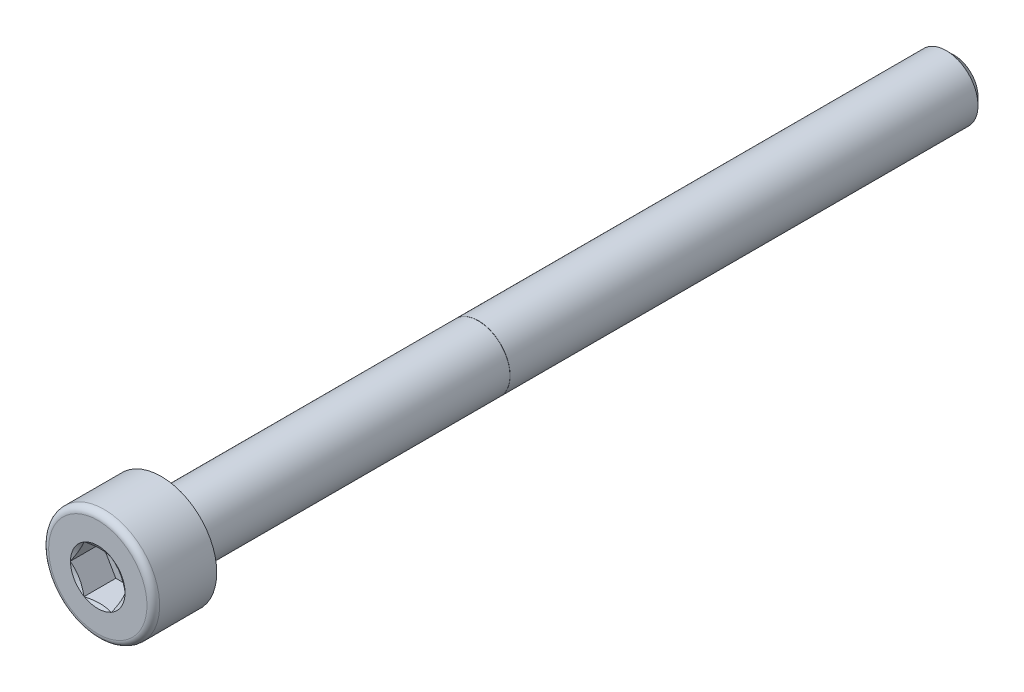
ISO-10303-21;
HEADER;
FILE_DESCRIPTION(('STEP AP214'),'2;1');
FILE_NAME('part.step','',(''),(''),'','','');
FILE_SCHEMA(('AUTOMOTIVE_DESIGN { 1 0 10303 214 1 1 1 1 }'));
ENDSEC;
DATA;
#1=APPLICATION_CONTEXT('core data for automotive mechanical design processes');
#2=APPLICATION_PROTOCOL_DEFINITION('international standard','automotive_design',2000,#1);
#3=PRODUCT_CONTEXT('',#1,'mechanical');
#4=PRODUCT('Part','Part','',(#3));
#5=PRODUCT_RELATED_PRODUCT_CATEGORY('part','',(#4));
#6=PRODUCT_DEFINITION_FORMATION('','',#4);
#7=PRODUCT_DEFINITION_CONTEXT('part definition',#1,'design');
#8=PRODUCT_DEFINITION('design','',#6,#7);
#9=PRODUCT_DEFINITION_SHAPE('','',#8);
#10=(LENGTH_UNIT() NAMED_UNIT(*) SI_UNIT(.MILLI.,.METRE.));
#11=(NAMED_UNIT(*) PLANE_ANGLE_UNIT() SI_UNIT($,.RADIAN.));
#12=(NAMED_UNIT(*) SI_UNIT($,.STERADIAN.) SOLID_ANGLE_UNIT());
#13=UNCERTAINTY_MEASURE_WITH_UNIT(LENGTH_MEASURE(1.E-05),#10,'distance_accuracy_value','');
#14=(GEOMETRIC_REPRESENTATION_CONTEXT(3) GLOBAL_UNCERTAINTY_ASSIGNED_CONTEXT((#13)) GLOBAL_UNIT_ASSIGNED_CONTEXT((#10,
#11,#12)) REPRESENTATION_CONTEXT('',''));
#15=CARTESIAN_POINT('',(0.,0.,0.));
#16=DIRECTION('',(0.,0.,1.));
#17=DIRECTION('',(1.,0.,0.));
#18=AXIS2_PLACEMENT_3D('',#15,#16,#17);
#19=CARTESIAN_POINT('',(0.,0.,4.));
#20=DIRECTION('',(0.,0.,-1.));
#21=DIRECTION('',(-1.,0.,0.));
#22=AXIS2_PLACEMENT_3D('',#19,#20,#21);
#23=PLANE('',#22);
#24=CARTESIAN_POINT('',(0.,0.,4.));
#25=DIRECTION('',(0.,0.,-1.));
#26=DIRECTION('',(-1.,0.,0.));
#27=AXIS2_PLACEMENT_3D('',#24,#25,#26);
#28=CIRCLE('',#27,3.1);
#29=CARTESIAN_POINT('',(-3.1,0.,4.));
#30=VERTEX_POINT('',#29);
#31=EDGE_CURVE('E210',#30,#30,#28,.F.);
#32=ORIENTED_EDGE('',*,*,#31,.T.);
#33=EDGE_LOOP('',(#32));
#34=FACE_BOUND('',#33,.T.);
#35=CARTESIAN_POINT('',(0.,0.,4.));
#36=DIRECTION('',(0.,0.,-1.));
#37=DIRECTION('',(-1.,0.,0.));
#38=AXIS2_PLACEMENT_3D('',#35,#36,#37);
#39=CIRCLE('',#38,1.72);
#40=CARTESIAN_POINT('',(-0.878205597426642,-1.47890328576567,4.));
#41=VERTEX_POINT('',#40);
#42=CARTESIAN_POINT('',(-1.71987061392668,-0.0210967142343167,4.));
#43=VERTEX_POINT('',#42);
#44=EDGE_CURVE('E421',#41,#43,#39,.T.);
#45=ORIENTED_EDGE('',*,*,#44,.T.);
#46=DIRECTION('',(-0.5,0.866025403784439,0.));
#47=VECTOR('',#46,1.);
#48=CARTESIAN_POINT('',(-0.866025403784435,-1.5,4.));
#49=LINE('',#48,#47);
#50=CARTESIAN_POINT('',(-1.73205080756887,0.,4.));
#51=VERTEX_POINT('',#50);
#52=EDGE_CURVE('E185',#43,#51,#49,.T.);
#53=ORIENTED_EDGE('',*,*,#52,.T.);
#54=DIRECTION('',(0.5,0.866025403784439,0.));
#55=VECTOR('',#54,1.);
#56=CARTESIAN_POINT('',(-1.73205080756887,0.,4.));
#57=LINE('',#56,#55);
#58=CARTESIAN_POINT('',(-1.71987061392667,0.0210967142343279,4.));
#59=VERTEX_POINT('',#58);
#60=EDGE_CURVE('E371',#51,#59,#57,.T.);
#61=ORIENTED_EDGE('',*,*,#60,.T.);
#62=CARTESIAN_POINT('',(-0.878205597426635,1.47890328576568,4.));
#63=VERTEX_POINT('',#62);
#64=EDGE_CURVE('E429',#59,#63,#39,.T.);
#65=ORIENTED_EDGE('',*,*,#64,.T.);
#66=CARTESIAN_POINT('',(-0.866025403784434,1.5,4.));
#67=VERTEX_POINT('',#66);
#68=EDGE_CURVE('E184',#63,#67,#57,.T.);
#69=ORIENTED_EDGE('',*,*,#68,.T.);
#70=DIRECTION('',(1.,0.,0.));
#71=VECTOR('',#70,1.);
#72=CARTESIAN_POINT('',(-0.866025403784435,1.5,4.));
#73=LINE('',#72,#71);
#74=CARTESIAN_POINT('',(-0.84166501650002,1.5,4.));
#75=VERTEX_POINT('',#74);
#76=EDGE_CURVE('E374',#67,#75,#73,.T.);
#77=ORIENTED_EDGE('',*,*,#76,.T.);
#78=CARTESIAN_POINT('',(0.841665016500033,1.5,4.));
#79=VERTEX_POINT('',#78);
#80=EDGE_CURVE('E389',#75,#79,#39,.T.);
#81=ORIENTED_EDGE('',*,*,#80,.T.);
#82=CARTESIAN_POINT('',(0.866025403784442,1.5,4.));
#83=VERTEX_POINT('',#82);
#84=EDGE_CURVE('E373',#79,#83,#73,.T.);
#85=ORIENTED_EDGE('',*,*,#84,.T.);
#86=DIRECTION('',(0.5,-0.866025403784439,0.));
#87=VECTOR('',#86,1.);
#88=CARTESIAN_POINT('',(0.866025403784443,1.5,4.));
#89=LINE('',#88,#87);
#90=CARTESIAN_POINT('',(0.878205597426654,1.47890328576566,4.));
#91=VERTEX_POINT('',#90);
#92=EDGE_CURVE('E174',#83,#91,#89,.T.);
#93=ORIENTED_EDGE('',*,*,#92,.T.);
#94=CARTESIAN_POINT('',(1.71987061392668,0.0210967142343314,4.));
#95=VERTEX_POINT('',#94);
#96=EDGE_CURVE('E149',#91,#95,#39,.T.);
#97=ORIENTED_EDGE('',*,*,#96,.T.);
#98=CARTESIAN_POINT('',(1.73205080756888,0.,4.));
#99=VERTEX_POINT('',#98);
#100=EDGE_CURVE('E161',#95,#99,#89,.T.);
#101=ORIENTED_EDGE('',*,*,#100,.T.);
#102=DIRECTION('',(-0.5,-0.866025403784439,0.));
#103=VECTOR('',#102,1.);
#104=CARTESIAN_POINT('',(1.73205080756888,0.,4.));
#105=LINE('',#104,#103);
#106=CARTESIAN_POINT('',(1.71987061392667,-0.0210967142343424,4.));
#107=VERTEX_POINT('',#106);
#108=EDGE_CURVE('E154',#99,#107,#105,.T.);
#109=ORIENTED_EDGE('',*,*,#108,.T.);
#110=CARTESIAN_POINT('',(0.878205597426648,-1.47890328576567,4.));
#111=VERTEX_POINT('',#110);
#112=EDGE_CURVE('E140',#107,#111,#39,.T.);
#113=ORIENTED_EDGE('',*,*,#112,.T.);
#114=CARTESIAN_POINT('',(0.866025403784443,-1.5,4.));
#115=VERTEX_POINT('',#114);
#116=EDGE_CURVE('E156',#111,#115,#105,.T.);
#117=ORIENTED_EDGE('',*,*,#116,.T.);
#118=DIRECTION('',(-1.,0.,0.));
#119=VECTOR('',#118,1.);
#120=CARTESIAN_POINT('',(0.866025403784443,-1.5,4.));
#121=LINE('',#120,#119);
#122=CARTESIAN_POINT('',(0.84166501650002,-1.5,4.));
#123=VERTEX_POINT('',#122);
#124=EDGE_CURVE('E171',#115,#123,#121,.T.);
#125=ORIENTED_EDGE('',*,*,#124,.T.);
#126=CARTESIAN_POINT('',(-0.841665016500033,-1.5,4.));
#127=VERTEX_POINT('',#126);
#128=EDGE_CURVE('E147',#123,#127,#39,.T.);
#129=ORIENTED_EDGE('',*,*,#128,.T.);
#130=CARTESIAN_POINT('',(-0.866025403784435,-1.5,4.));
#131=VERTEX_POINT('',#130);
#132=EDGE_CURVE('E164',#127,#131,#121,.T.);
#133=ORIENTED_EDGE('',*,*,#132,.T.);
#134=EDGE_CURVE('E180',#131,#41,#49,.T.);
#135=ORIENTED_EDGE('',*,*,#134,.T.);
#136=EDGE_LOOP('',(#45,#53,#61,#65,#69,#77,#81,#85,#93,#97,#101,#109,#113,#117,#125,#129,#133,#135));
#137=FACE_BOUND('',#136,.T.);
#138=ADVANCED_FACE('F52',(#34,#137),#23,.F.);
#139=CARTESIAN_POINT('',(-0.866025403784435,-1.5,2.));
#140=DIRECTION('',(0.866025403784439,0.5,0.));
#141=DIRECTION('',(-0.5,0.866025403784439,0.));
#142=AXIS2_PLACEMENT_3D('',#139,#140,#141);
#143=PLANE('',#142);
#144=ORIENTED_EDGE('',*,*,#52,.F.);
#145=CARTESIAN_POINT('',(-1.7202,-0.0205262008200219,4.00018617212275));
#146=CARTESIAN_POINT('',(-1.68234113159446,-0.086099684415467,3.97877075204242));
#147=CARTESIAN_POINT('',(-1.6441552323571,-0.152239602027289,3.95938062565903));
#148=CARTESIAN_POINT('',(-1.56713888844143,-0.285635822702415,3.9257323619316));
#149=CARTESIAN_POINT('',(-1.52830719485098,-0.35289428894502,3.91148578153355));
#150=CARTESIAN_POINT('',(-1.45111938690559,-0.486587494031315,3.88957867180218));
#151=CARTESIAN_POINT('',(-1.41277433720786,-0.553003068326531,3.88176781039442));
#152=CARTESIAN_POINT('',(-1.33592746850361,-0.686105749324875,3.87290880610961));
#153=CARTESIAN_POINT('',(-1.29742588302806,-0.752792451540485,3.87185282675306));
#154=CARTESIAN_POINT('',(-1.22705396539922,-0.874680188299675,3.8761808350096));
#155=CARTESIAN_POINT('',(-1.1951658372562,-0.929912046401664,3.88050354767926));
#156=CARTESIAN_POINT('',(-1.13159436885885,-1.04002105957763,3.89356772163071));
#157=CARTESIAN_POINT('',(-1.09991120852363,-1.09489790302259,3.90231264048743));
#158=CARTESIAN_POINT('',(-1.03623495888569,-1.20518840263094,3.92392283350078));
#159=CARTESIAN_POINT('',(-1.00424892174853,-1.26058984408528,3.93686924438116));
#160=CARTESIAN_POINT('',(-0.94072173004776,-1.37062216777318,3.9661538629847));
#161=CARTESIAN_POINT('',(-0.909179912939322,-1.42525419756804,3.98248628068356));
#162=CARTESIAN_POINT('',(-0.877851754118318,-1.4795161603536,4.00020000000008));
#163=B_SPLINE_CURVE_WITH_KNOTS('',3,(#145,#146,#147,#148,#149,#150,#151,#152,#153,#154,#155,
#156,#157,#158,#159,#160,#161,#162),.UNSPECIFIED.,.F.,.F.,(4,2,2,2,2,2,2,2,4),(0.,
0.236154969897055,0.472837297811892,0.703820283452353,0.934535252242766,1.12614255086357,
1.31789989298118,1.51360582474349,1.70897982229468),.UNSPECIFIED.);
#164=EDGE_CURVE('E66',#43,#41,#163,.T.);
#165=ORIENTED_EDGE('',*,*,#164,.T.);
#166=ORIENTED_EDGE('',*,*,#134,.F.);
#167=DIRECTION('',(0.,0.,1.));
#168=VECTOR('',#167,1.);
#169=CARTESIAN_POINT('',(-0.866025403784435,-1.5,2.));
#170=LINE('',#169,#168);
#171=CARTESIAN_POINT('',(-0.866025403784435,-1.5,2.));
#172=VERTEX_POINT('',#171);
#173=EDGE_CURVE('E186',#172,#131,#170,.T.);
#174=ORIENTED_EDGE('',*,*,#173,.F.);
#175=DIRECTION('',(-0.5,0.866025403784439,0.));
#176=VECTOR('',#175,1.);
#177=CARTESIAN_POINT('',(-0.866025403784435,-1.5,2.));
#178=LINE('',#177,#176);
#179=CARTESIAN_POINT('',(-1.73205080756887,0.,2.));
#180=VERTEX_POINT('',#179);
#181=EDGE_CURVE('E179',#172,#180,#178,.T.);
#182=ORIENTED_EDGE('',*,*,#181,.T.);
#183=DIRECTION('',(0.,0.,1.));
#184=VECTOR('',#183,1.);
#185=CARTESIAN_POINT('',(-1.73205080756887,0.,2.));
#186=LINE('',#185,#184);
#187=EDGE_CURVE('E200',#180,#51,#186,.T.);
#188=ORIENTED_EDGE('',*,*,#187,.T.);
#189=EDGE_LOOP('',(#144,#165,#166,#174,#182,#188));
#190=FACE_BOUND('',#189,.T.);
#191=ADVANCED_FACE('F240',(#190),#143,.T.);
#192=CARTESIAN_POINT('',(-1.73205080756887,0.,2.));
#193=DIRECTION('',(0.866025403784439,-0.5,0.));
#194=DIRECTION('',(0.5,0.866025403784439,0.));
#195=AXIS2_PLACEMENT_3D('',#192,#193,#194);
#196=PLANE('',#195);
#197=ORIENTED_EDGE('',*,*,#68,.F.);
#198=CARTESIAN_POINT('',(-0.877851754118318,1.4795161603536,4.00020000000008));
#199=CARTESIAN_POINT('',(-0.915711009581921,1.41394200635392,3.97878342531498));
#200=CARTESIAN_POINT('',(-0.95389729910329,1.34780141275037,3.95939206993327));
#201=CARTESIAN_POINT('',(-1.03091446353875,1.21440377089328,3.92574125374408));
#202=CARTESIAN_POINT('',(-1.06974658759877,1.14714455905549,3.9114933512908));
#203=CARTESIAN_POINT('',(-1.14693527467058,1.01344983127758,3.88958361519279));
#204=CARTESIAN_POINT('',(-1.18528077165032,0.947033482267196,3.88177144690551));
#205=CARTESIAN_POINT('',(-1.26212858820376,0.813929159545904,3.87290993013783));
#206=CARTESIAN_POINT('',(-1.30063067415791,0.747241590475927,3.87185274434481));
#207=CARTESIAN_POINT('',(-1.37100261718254,0.625353809729941,3.87617869006257));
#208=CARTESIAN_POINT('',(-1.40289026530762,0.570122783043419,3.88050037423462));
#209=CARTESIAN_POINT('',(-1.46646080926146,0.460015371050572,3.89356244001548));
#210=CARTESIAN_POINT('',(-1.49814352520577,0.40513929731326,3.90230627904761));
#211=CARTESIAN_POINT('',(-1.56181889523054,0.294850321239605,3.92391429857169));
#212=CARTESIAN_POINT('',(-1.59380449784194,0.23944963240596,3.93685961475354));
#213=CARTESIAN_POINT('',(-1.65733084354151,0.129418774035111,3.96614209099638));
#214=CARTESIAN_POINT('',(-1.68887224909577,0.0747874570730016,3.98247346137429));
#215=CARTESIAN_POINT('',(-1.7202,0.0205262008200216,4.00018617212275));
#216=B_SPLINE_CURVE_WITH_KNOTS('',3,(#198,#199,#200,#201,#202,#203,#204,#205,#206,#207,#208,
#209,#210,#211,#212,#213,#214,#215),.UNSPECIFIED.,.F.,.F.,(4,2,2,2,2,2,2,2,4),(0.,
0.236158152802641,0.472843743726543,0.703829797164596,0.934547805625785,1.12615202657784,
1.31790628374526,1.51360900549696,1.70897982228312),.UNSPECIFIED.);
#217=EDGE_CURVE('E73',#63,#59,#216,.T.);
#218=ORIENTED_EDGE('',*,*,#217,.T.);
#219=ORIENTED_EDGE('',*,*,#60,.F.);
#220=ORIENTED_EDGE('',*,*,#187,.F.);
#221=DIRECTION('',(0.5,0.866025403784439,0.));
#222=VECTOR('',#221,1.);
#223=CARTESIAN_POINT('',(-1.73205080756887,0.,2.));
#224=LINE('',#223,#222);
#225=CARTESIAN_POINT('',(-0.866025403784434,1.5,2.));
#226=VERTEX_POINT('',#225);
#227=EDGE_CURVE('E360',#180,#226,#224,.T.);
#228=ORIENTED_EDGE('',*,*,#227,.T.);
#229=DIRECTION('',(0.,0.,1.));
#230=VECTOR('',#229,1.);
#231=CARTESIAN_POINT('',(-0.866025403784434,1.5,2.));
#232=LINE('',#231,#230);
#233=EDGE_CURVE('E197',#226,#67,#232,.T.);
#234=ORIENTED_EDGE('',*,*,#233,.T.);
#235=EDGE_LOOP('',(#197,#218,#219,#220,#228,#234));
#236=FACE_BOUND('',#235,.T.);
#237=ADVANCED_FACE('F236',(#236),#196,.T.);
#238=CARTESIAN_POINT('',(-0.866025403784435,1.5,2.));
#239=DIRECTION('',(0.,-1.,0.));
#240=DIRECTION('',(0.,0.,-1.));
#241=AXIS2_PLACEMENT_3D('',#238,#239,#240);
#242=PLANE('',#241);
#243=ORIENTED_EDGE('',*,*,#84,.F.);
#244=CARTESIAN_POINT('',(-2.23964579854262,1.5,4.56323657184264));
#245=CARTESIAN_POINT('',(-2.17494365404022,1.5,4.53220808732798));
#246=CARTESIAN_POINT('',(-2.11008377799559,1.5,4.50150272768119));
#247=CARTESIAN_POINT('',(-1.97996425045645,1.5,4.44092123113282));
#248=CARTESIAN_POINT('',(-1.91470452943693,1.5,4.41104524374277));
#249=CARTESIAN_POINT('',(-1.78332684567672,1.5,4.3521385840455));
#250=CARTESIAN_POINT('',(-1.71720607814487,1.5,4.32311413905211));
#251=CARTESIAN_POINT('',(-1.58441029846919,1.5,4.26637017287408));
#252=CARTESIAN_POINT('',(-1.51773531536775,1.5,4.23865058381236));
#253=CARTESIAN_POINT('',(-1.3819734326991,1.5,4.18415836543705));
#254=CARTESIAN_POINT('',(-1.31286889540382,1.5,4.15742909509239));
#255=CARTESIAN_POINT('',(-1.17383900185469,1.5,4.10620567755377));
#256=CARTESIAN_POINT('',(-1.10391354418551,1.5,4.08171180986857));
#257=CARTESIAN_POINT('',(-0.893020199985855,1.5,4.01261693581903));
#258=CARTESIAN_POINT('',(-0.750549480565456,1.5,3.97224054845565));
#259=CARTESIAN_POINT('',(-0.533921256204983,1.5,3.92540338472583));
#260=CARTESIAN_POINT('',(-0.461254160512176,1.5,3.9120814599479));
#261=CARTESIAN_POINT('',(-0.315104291919138,1.5,3.89094255840741));
#262=CARTESIAN_POINT('',(-0.241621574086976,1.5,3.88312521226313));
#263=CARTESIAN_POINT('',(-0.0951302930815691,1.5,3.87371851158538));
#264=CARTESIAN_POINT('',(-0.0221265614997347,1.5,3.8720558289902));
#265=CARTESIAN_POINT('',(0.123757976918579,1.5,3.8749036706019));
#266=CARTESIAN_POINT('',(0.19663877581326,1.5,3.87941457941716));
#267=CARTESIAN_POINT('',(0.376558390602655,1.5,3.89777427840339));
#268=CARTESIAN_POINT('',(0.483246593294496,1.5,3.91505958329039));
#269=CARTESIAN_POINT('',(0.69454553326028,1.5,3.95960749624142));
#270=CARTESIAN_POINT('',(0.799153601900663,1.5,3.98688214599711));
#271=CARTESIAN_POINT('',(0.955604981987814,1.5,4.03346229494378));
#272=CARTESIAN_POINT('',(1.00825722287058,1.5,4.05015067915789));
#273=CARTESIAN_POINT('',(1.11301362914179,1.5,4.08506824158718));
#274=CARTESIAN_POINT('',(1.16511811426323,1.5,4.10329645755911));
#275=CARTESIAN_POINT('',(1.26884872400367,1.5,4.14102923359481));
#276=CARTESIAN_POINT('',(1.32047493427544,1.5,4.16053355987459));
#277=CARTESIAN_POINT('',(1.42332079975062,1.5,4.2006078936452));
#278=CARTESIAN_POINT('',(1.47454038447553,1.5,4.22117808141884));
#279=CARTESIAN_POINT('',(1.60513220874614,1.5,4.27493877790037));
#280=CARTESIAN_POINT('',(1.68424485918609,1.5,4.30875918455725));
#281=CARTESIAN_POINT('',(1.84175743125615,1.5,4.37802526858655));
#282=CARTESIAN_POINT('',(1.92015729934562,1.5,4.41347106686119));
#283=CARTESIAN_POINT('',(2.15452480919957,1.5,4.52167428574569));
#284=CARTESIAN_POINT('',(2.30963443045188,1.5,4.596286542218));
#285=CARTESIAN_POINT('',(2.61853006913033,1.5,4.74863466117394));
#286=CARTESIAN_POINT('',(2.77231423459033,1.5,4.82637423429458));
#287=CARTESIAN_POINT('',(3.07883024631939,1.5,4.98385008837718));
#288=CARTESIAN_POINT('',(3.23156222225332,1.5,5.06358611748625));
#289=CARTESIAN_POINT('',(3.52195034512852,1.5,5.21686129486434));
#290=CARTESIAN_POINT('',(3.65967188266485,1.5,5.29027698588156));
#291=CARTESIAN_POINT('',(3.93467203498717,1.5,5.43794466629772));
#292=CARTESIAN_POINT('',(4.07195063326731,1.5,5.51219668640932));
#293=CARTESIAN_POINT('',(4.34581933165086,1.5,5.66113861341303));
#294=CARTESIAN_POINT('',(4.48241029493277,1.5,5.73582693524336));
#295=CARTESIAN_POINT('',(4.75531608851961,1.5,5.88568978681276));
#296=CARTESIAN_POINT('',(4.89163093282215,1.5,5.96086429105187));
#297=CARTESIAN_POINT('',(5.02784653446169,1.5,6.03621711507001));
#298=B_SPLINE_CURVE_WITH_KNOTS('',3,(#244,#245,#246,#247,#248,#249,#250,#251,#252,#253,#254,
#255,#256,#257,#258,#259,#260,#261,#262,#263,#264,#265,#266,#267,#268,#269,#270,#271,#272,#273,
#274,#275,#276,#277,#278,#279,#280,#281,#282,#283,#284,#285,#286,#287,#288,#289,#290,#291,#292,
#293,#294,#295,#296,#297),.UNSPECIFIED.,.F.,.F.,(4,2,2,2,2,2,2,2,2,2,2,2,2,2,2,2,2,2,2,2,2,2,2,
2,2,2,4),(0.,0.215275167134218,0.430588893327582,0.64720876696885,0.863817359817696,
1.08605773737867,1.30832586531647,1.75160850890337,1.97307460161778,2.19452583155554,
2.41332998987057,2.63214778007924,2.95572072290309,3.27968500863731,3.44536787172103,
3.6109479545636,3.77649778754155,3.94207571407539,4.2001649019846,4.45827331869782,
4.97457458242948,5.49150764539466,6.00837582258564,6.47657525279929,6.94479193319741,
7.41182291582094,7.87882959847676),.UNSPECIFIED.);
#299=EDGE_CURVE('E323',#79,#75,#298,.F.);
#300=ORIENTED_EDGE('',*,*,#299,.T.);
#301=ORIENTED_EDGE('',*,*,#76,.F.);
#302=ORIENTED_EDGE('',*,*,#233,.F.);
#303=DIRECTION('',(1.,0.,0.));
#304=VECTOR('',#303,1.);
#305=CARTESIAN_POINT('',(-0.866025403784435,1.5,2.));
#306=LINE('',#305,#304);
#307=CARTESIAN_POINT('',(0.866025403784442,1.5,2.));
#308=VERTEX_POINT('',#307);
#309=EDGE_CURVE('E362',#226,#308,#306,.T.);
#310=ORIENTED_EDGE('',*,*,#309,.T.);
#311=DIRECTION('',(0.,0.,1.));
#312=VECTOR('',#311,1.);
#313=CARTESIAN_POINT('',(0.866025403784442,1.5,2.));
#314=LINE('',#313,#312);
#315=EDGE_CURVE('E194',#308,#83,#314,.T.);
#316=ORIENTED_EDGE('',*,*,#315,.T.);
#317=EDGE_LOOP('',(#243,#300,#301,#302,#310,#316));
#318=FACE_BOUND('',#317,.T.);
#319=ADVANCED_FACE('F232',(#318),#242,.T.);
#320=CARTESIAN_POINT('',(0.866025403784443,1.5,2.));
#321=DIRECTION('',(-0.866025403784439,-0.5,0.));
#322=DIRECTION('',(0.5,-0.866025403784439,0.));
#323=AXIS2_PLACEMENT_3D('',#320,#321,#322);
#324=PLANE('',#323);
#325=ORIENTED_EDGE('',*,*,#100,.F.);
#326=CARTESIAN_POINT('',(1.7202,0.0205262008200362,4.00018617212275));
#327=CARTESIAN_POINT('',(1.68234113159446,0.086099684415481,3.97877075204242));
#328=CARTESIAN_POINT('',(1.6441552323571,0.152239602027303,3.95938062565903));
#329=CARTESIAN_POINT('',(1.56713888844143,0.285635822702429,3.9257323619316));
#330=CARTESIAN_POINT('',(1.52830719485098,0.352894288945034,3.91148578153355));
#331=CARTESIAN_POINT('',(1.45111938690559,0.486587494031329,3.88957867180218));
#332=CARTESIAN_POINT('',(1.41277433720786,0.553003068326546,3.88176781039442));
#333=CARTESIAN_POINT('',(1.33592746850361,0.68610574932489,3.87290880610961));
#334=CARTESIAN_POINT('',(1.29742588302806,0.7527924515405,3.87185282675307));
#335=CARTESIAN_POINT('',(1.22705396539922,0.874680188299688,3.87618083500961));
#336=CARTESIAN_POINT('',(1.1951658372562,0.929912046401675,3.88050354767927));
#337=CARTESIAN_POINT('',(1.13159436885885,1.04002105957763,3.89356772163072));
#338=CARTESIAN_POINT('',(1.09991120852363,1.09489790302259,3.90231264048744));
#339=CARTESIAN_POINT('',(1.03623495888569,1.20518840263094,3.92392283350078));
#340=CARTESIAN_POINT('',(1.00424892174853,1.26058984408528,3.93686924438116));
#341=CARTESIAN_POINT('',(0.940721730047771,1.37062216777318,3.9661538629847));
#342=CARTESIAN_POINT('',(0.909179912939334,1.42525419756803,3.98248628068356));
#343=CARTESIAN_POINT('',(0.877851754118331,1.4795161603536,4.00020000000008));
#344=B_SPLINE_CURVE_WITH_KNOTS('',3,(#326,#327,#328,#329,#330,#331,#332,#333,#334,#335,#336,
#337,#338,#339,#340,#341,#342,#343),.UNSPECIFIED.,.F.,.F.,(4,2,2,2,2,2,2,2,4),(0.,
0.236154969897055,0.472837297811892,0.703820283452353,0.934535252242766,1.12614255086356,
1.31789989298116,1.51360582474347,1.70897982229465),.UNSPECIFIED.);
#345=EDGE_CURVE('E157',#95,#91,#344,.T.);
#346=ORIENTED_EDGE('',*,*,#345,.T.);
#347=ORIENTED_EDGE('',*,*,#92,.F.);
#348=ORIENTED_EDGE('',*,*,#315,.F.);
#349=DIRECTION('',(0.5,-0.866025403784439,0.));
#350=VECTOR('',#349,1.);
#351=CARTESIAN_POINT('',(0.866025403784443,1.5,2.));
#352=LINE('',#351,#350);
#353=CARTESIAN_POINT('',(1.73205080756888,0.,2.));
#354=VERTEX_POINT('',#353);
#355=EDGE_CURVE('E364',#308,#354,#352,.T.);
#356=ORIENTED_EDGE('',*,*,#355,.T.);
#357=DIRECTION('',(0.,0.,1.));
#358=VECTOR('',#357,1.);
#359=CARTESIAN_POINT('',(1.73205080756888,0.,2.));
#360=LINE('',#359,#358);
#361=EDGE_CURVE('E192',#354,#99,#360,.T.);
#362=ORIENTED_EDGE('',*,*,#361,.T.);
#363=EDGE_LOOP('',(#325,#346,#347,#348,#356,#362));
#364=FACE_BOUND('',#363,.T.);
#365=ADVANCED_FACE('F229',(#364),#324,.T.);
#366=CARTESIAN_POINT('',(1.73205080756888,0.,2.));
#367=DIRECTION('',(-0.866025403784439,0.5,0.));
#368=DIRECTION('',(-0.5,-0.866025403784439,0.));
#369=AXIS2_PLACEMENT_3D('',#366,#367,#368);
#370=PLANE('',#369);
#371=ORIENTED_EDGE('',*,*,#116,.F.);
#372=CARTESIAN_POINT('',(0.877851754118331,-1.4795161603536,4.00020000000008));
#373=CARTESIAN_POINT('',(0.915711009581932,-1.41394200635391,3.97878342531498));
#374=CARTESIAN_POINT('',(0.9538972991033,-1.34780141275036,3.95939206993327));
#375=CARTESIAN_POINT('',(1.03091446353876,-1.21440377089327,3.92574125374408));
#376=CARTESIAN_POINT('',(1.06974658759878,-1.14714455905548,3.9114933512908));
#377=CARTESIAN_POINT('',(1.14693527467059,-1.01344983127757,3.88958361519279));
#378=CARTESIAN_POINT('',(1.18528077165033,-0.947033482267186,3.88177144690552));
#379=CARTESIAN_POINT('',(1.26212858820377,-0.813929159545894,3.87290993013783));
#380=CARTESIAN_POINT('',(1.30063067415793,-0.747241590475919,3.87185274434482));
#381=CARTESIAN_POINT('',(1.37100261718255,-0.625353809729933,3.87617869006258));
#382=CARTESIAN_POINT('',(1.40289026530763,-0.570122783043413,3.88050037423462));
#383=CARTESIAN_POINT('',(1.46646080926147,-0.460015371050569,3.89356244001548));
#384=CARTESIAN_POINT('',(1.49814352520577,-0.40513929731326,3.90230627904761));
#385=CARTESIAN_POINT('',(1.56181889523054,-0.294850321239608,3.92391429857169));
#386=CARTESIAN_POINT('',(1.59380449784194,-0.239449632405965,3.93685961475355));
#387=CARTESIAN_POINT('',(1.65733084354151,-0.12941877403512,3.96614209099638));
#388=CARTESIAN_POINT('',(1.68887224909577,-0.0747874570730131,3.98247346137429));
#389=CARTESIAN_POINT('',(1.7202,-0.0205262008200363,4.00018617212275));
#390=B_SPLINE_CURVE_WITH_KNOTS('',3,(#372,#373,#374,#375,#376,#377,#378,#379,#380,#381,#382,
#383,#384,#385,#386,#387,#388,#389),.UNSPECIFIED.,.F.,.F.,(4,2,2,2,2,2,2,2,4),(0.,
0.236158152802641,0.472843743726543,0.703829797164596,0.934547805625785,1.12615202657784,
1.31790628374525,1.51360900549694,1.70897982228309),.UNSPECIFIED.);
#391=EDGE_CURVE('E143',#111,#107,#390,.T.);
#392=ORIENTED_EDGE('',*,*,#391,.T.);
#393=ORIENTED_EDGE('',*,*,#108,.F.);
#394=ORIENTED_EDGE('',*,*,#361,.F.);
#395=DIRECTION('',(-0.5,-0.866025403784439,0.));
#396=VECTOR('',#395,1.);
#397=CARTESIAN_POINT('',(1.73205080756888,0.,2.));
#398=LINE('',#397,#396);
#399=CARTESIAN_POINT('',(0.866025403784443,-1.5,2.));
#400=VERTEX_POINT('',#399);
#401=EDGE_CURVE('E366',#354,#400,#398,.T.);
#402=ORIENTED_EDGE('',*,*,#401,.T.);
#403=DIRECTION('',(0.,0.,1.));
#404=VECTOR('',#403,1.);
#405=CARTESIAN_POINT('',(0.866025403784443,-1.5,2.));
#406=LINE('',#405,#404);
#407=EDGE_CURVE('E189',#400,#115,#406,.T.);
#408=ORIENTED_EDGE('',*,*,#407,.T.);
#409=EDGE_LOOP('',(#371,#392,#393,#394,#402,#408));
#410=FACE_BOUND('',#409,.T.);
#411=ADVANCED_FACE('F152',(#410),#370,.T.);
#412=CARTESIAN_POINT('',(0.866025403784443,-1.5,2.));
#413=DIRECTION('',(0.,1.,0.));
#414=DIRECTION('',(0.,0.,1.));
#415=AXIS2_PLACEMENT_3D('',#412,#413,#414);
#416=PLANE('',#415);
#417=ORIENTED_EDGE('',*,*,#132,.F.);
#418=CARTESIAN_POINT('',(-2.23964579854262,-1.5,4.56323657184264));
#419=CARTESIAN_POINT('',(-2.17494365404022,-1.5,4.53220808732798));
#420=CARTESIAN_POINT('',(-2.11008377799559,-1.5,4.50150272768119));
#421=CARTESIAN_POINT('',(-1.97996425045645,-1.5,4.44092123113282));
#422=CARTESIAN_POINT('',(-1.91470452943693,-1.5,4.41104524374277));
#423=CARTESIAN_POINT('',(-1.78332684567672,-1.5,4.3521385840455));
#424=CARTESIAN_POINT('',(-1.71720607814487,-1.5,4.32311413905211));
#425=CARTESIAN_POINT('',(-1.58441029846919,-1.5,4.26637017287408));
#426=CARTESIAN_POINT('',(-1.51773531536775,-1.5,4.23865058381236));
#427=CARTESIAN_POINT('',(-1.3819734326991,-1.5,4.18415836543705));
#428=CARTESIAN_POINT('',(-1.31286889540382,-1.5,4.15742909509239));
#429=CARTESIAN_POINT('',(-1.17383900185469,-1.5,4.10620567755377));
#430=CARTESIAN_POINT('',(-1.10391354418551,-1.5,4.08171180986857));
#431=CARTESIAN_POINT('',(-0.893020199985855,-1.5,4.01261693581903));
#432=CARTESIAN_POINT('',(-0.750549480565456,-1.5,3.97224054845565));
#433=CARTESIAN_POINT('',(-0.533921256204983,-1.5,3.92540338472583));
#434=CARTESIAN_POINT('',(-0.461254160512176,-1.5,3.9120814599479));
#435=CARTESIAN_POINT('',(-0.315104291919138,-1.5,3.89094255840741));
#436=CARTESIAN_POINT('',(-0.241621574086976,-1.5,3.88312521226313));
#437=CARTESIAN_POINT('',(-0.0951302930815691,-1.5,3.87371851158538));
#438=CARTESIAN_POINT('',(-0.0221265614997347,-1.5,3.8720558289902));
#439=CARTESIAN_POINT('',(0.123757976918579,-1.5,3.8749036706019));
#440=CARTESIAN_POINT('',(0.19663877581326,-1.5,3.87941457941716));
#441=CARTESIAN_POINT('',(0.376558390602655,-1.5,3.89777427840339));
#442=CARTESIAN_POINT('',(0.483246593294496,-1.5,3.91505958329039));
#443=CARTESIAN_POINT('',(0.69454553326028,-1.5,3.95960749624142));
#444=CARTESIAN_POINT('',(0.799153601900663,-1.5,3.98688214599711));
#445=CARTESIAN_POINT('',(0.955604981987814,-1.5,4.03346229494378));
#446=CARTESIAN_POINT('',(1.00825722287058,-1.5,4.05015067915789));
#447=CARTESIAN_POINT('',(1.11301362914179,-1.5,4.08506824158718));
#448=CARTESIAN_POINT('',(1.16511811426323,-1.5,4.10329645755911));
#449=CARTESIAN_POINT('',(1.26884872400367,-1.5,4.14102923359481));
#450=CARTESIAN_POINT('',(1.32047493427544,-1.5,4.16053355987459));
#451=CARTESIAN_POINT('',(1.42332079975062,-1.5,4.2006078936452));
#452=CARTESIAN_POINT('',(1.47454038447553,-1.5,4.22117808141884));
#453=CARTESIAN_POINT('',(1.60513220874614,-1.5,4.27493877790037));
#454=CARTESIAN_POINT('',(1.68424485918609,-1.5,4.30875918455725));
#455=CARTESIAN_POINT('',(1.84175743125615,-1.5,4.37802526858655));
#456=CARTESIAN_POINT('',(1.92015729934562,-1.5,4.41347106686119));
#457=CARTESIAN_POINT('',(2.15452480919957,-1.5,4.52167428574569));
#458=CARTESIAN_POINT('',(2.30963443045188,-1.5,4.596286542218));
#459=CARTESIAN_POINT('',(2.61853006913033,-1.5,4.74863466117394));
#460=CARTESIAN_POINT('',(2.77231423459033,-1.5,4.82637423429458));
#461=CARTESIAN_POINT('',(3.07883024631939,-1.5,4.98385008837718));
#462=CARTESIAN_POINT('',(3.23156222225332,-1.5,5.06358611748625));
#463=CARTESIAN_POINT('',(3.52195034512852,-1.5,5.21686129486434));
#464=CARTESIAN_POINT('',(3.65967188266485,-1.5,5.29027698588156));
#465=CARTESIAN_POINT('',(3.93467203498717,-1.5,5.43794466629772));
#466=CARTESIAN_POINT('',(4.07195063326731,-1.5,5.51219668640932));
#467=CARTESIAN_POINT('',(4.34581933165086,-1.5,5.66113861341303));
#468=CARTESIAN_POINT('',(4.48241029493277,-1.5,5.73582693524336));
#469=CARTESIAN_POINT('',(4.75531608851961,-1.5,5.88568978681276));
#470=CARTESIAN_POINT('',(4.89163093282215,-1.5,5.96086429105187));
#471=CARTESIAN_POINT('',(5.02784653446169,-1.5,6.03621711507001));
#472=B_SPLINE_CURVE_WITH_KNOTS('',3,(#418,#419,#420,#421,#422,#423,#424,#425,#426,#427,#428,
#429,#430,#431,#432,#433,#434,#435,#436,#437,#438,#439,#440,#441,#442,#443,#444,#445,#446,#447,
#448,#449,#450,#451,#452,#453,#454,#455,#456,#457,#458,#459,#460,#461,#462,#463,#464,#465,#466,
#467,#468,#469,#470,#471),.UNSPECIFIED.,.F.,.F.,(4,2,2,2,2,2,2,2,2,2,2,2,2,2,2,2,2,2,2,2,2,2,2,
2,2,2,4),(0.,0.215275167134218,0.430588893327582,0.64720876696885,0.863817359817696,
1.08605773737867,1.30832586531647,1.75160850890337,1.97307460161778,2.19452583155554,
2.41332998987057,2.63214778007924,2.95572072290309,3.27968500863731,3.44536787172103,
3.6109479545636,3.77649778754155,3.94207571407539,4.2001649019846,4.45827331869782,
4.97457458242948,5.49150764539466,6.00837582258564,6.47657525279929,6.94479193319741,
7.41182291582094,7.87882959847676),.UNSPECIFIED.);
#473=EDGE_CURVE('E213',#127,#123,#472,.T.);
#474=ORIENTED_EDGE('',*,*,#473,.T.);
#475=ORIENTED_EDGE('',*,*,#124,.F.);
#476=ORIENTED_EDGE('',*,*,#407,.F.);
#477=DIRECTION('',(-1.,0.,0.));
#478=VECTOR('',#477,1.);
#479=CARTESIAN_POINT('',(0.866025403784443,-1.5,2.));
#480=LINE('',#479,#478);
#481=EDGE_CURVE('E190',#400,#172,#480,.T.);
#482=ORIENTED_EDGE('',*,*,#481,.T.);
#483=ORIENTED_EDGE('',*,*,#173,.T.);
#484=EDGE_LOOP('',(#417,#474,#475,#476,#482,#483));
#485=FACE_BOUND('',#484,.T.);
#486=ADVANCED_FACE('F220',(#485),#416,.T.);
#487=CARTESIAN_POINT('',(0.,0.,0.));
#488=DIRECTION('',(0.,0.,-1.));
#489=DIRECTION('',(-1.,0.,0.));
#490=AXIS2_PLACEMENT_3D('',#487,#488,#489);
#491=PLANE('',#490);
#492=CARTESIAN_POINT('',(0.,0.,0.));
#493=DIRECTION('',(0.,0.,-1.));
#494=DIRECTION('',(1.,0.,0.));
#495=AXIS2_PLACEMENT_3D('',#492,#493,#494);
#496=CIRCLE('',#495,3.5);
#497=CARTESIAN_POINT('',(3.5,0.,0.));
#498=VERTEX_POINT('',#497);
#499=EDGE_CURVE('E203',#498,#498,#496,.T.);
#500=ORIENTED_EDGE('',*,*,#499,.T.);
#501=EDGE_LOOP('',(#500));
#502=FACE_BOUND('',#501,.T.);
#503=CARTESIAN_POINT('',(0.,0.,0.));
#504=DIRECTION('',(0.,0.,-1.));
#505=DIRECTION('',(-1.,0.,0.));
#506=AXIS2_PLACEMENT_3D('',#503,#504,#505);
#507=CIRCLE('',#506,2.2);
#508=CARTESIAN_POINT('',(-2.2,0.,0.));
#509=VERTEX_POINT('',#508);
#510=EDGE_CURVE('E357',#509,#509,#507,.T.);
#511=ORIENTED_EDGE('',*,*,#510,.F.);
#512=EDGE_LOOP('',(#511));
#513=FACE_BOUND('',#512,.T.);
#514=ADVANCED_FACE('F225',(#502,#513),#491,.T.);
#515=CARTESIAN_POINT('',(0.,0.,4.));
#516=DIRECTION('',(0.,0.,-1.));
#517=DIRECTION('',(-1.,0.,0.));
#518=AXIS2_PLACEMENT_3D('',#515,#516,#517);
#519=CYLINDRICAL_SURFACE('',#518,3.5);
#520=CARTESIAN_POINT('',(0.,0.,3.6));
#521=DIRECTION('',(0.,0.,-1.));
#522=DIRECTION('',(-1.,0.,0.));
#523=AXIS2_PLACEMENT_3D('',#520,#521,#522);
#524=CIRCLE('',#523,3.5);
#525=CARTESIAN_POINT('',(-3.5,0.,3.6));
#526=VERTEX_POINT('',#525);
#527=EDGE_CURVE('E207',#526,#526,#524,.T.);
#528=ORIENTED_EDGE('',*,*,#527,.T.);
#529=EDGE_LOOP('',(#528));
#530=FACE_BOUND('',#529,.T.);
#531=ORIENTED_EDGE('',*,*,#499,.F.);
#532=EDGE_LOOP('',(#531));
#533=FACE_BOUND('',#532,.T.);
#534=ADVANCED_FACE('F251',(#530,#533),#519,.T.);
#535=CARTESIAN_POINT('',(-1.73205080756887,0.,2.));
#536=DIRECTION('',(0.,0.,-1.));
#537=DIRECTION('',(-1.,0.,0.));
#538=AXIS2_PLACEMENT_3D('',#535,#536,#537);
#539=PLANE('',#538);
#540=ORIENTED_EDGE('',*,*,#181,.F.);
#541=ORIENTED_EDGE('',*,*,#481,.F.);
#542=ORIENTED_EDGE('',*,*,#401,.F.);
#543=ORIENTED_EDGE('',*,*,#355,.F.);
#544=ORIENTED_EDGE('',*,*,#309,.F.);
#545=ORIENTED_EDGE('',*,*,#227,.F.);
#546=EDGE_LOOP('',(#540,#541,#542,#543,#544,#545));
#547=FACE_BOUND('',#546,.T.);
#548=ADVANCED_FACE('F249',(#547),#539,.F.);
#549=CARTESIAN_POINT('',(0.,0.,3.6));
#550=DIRECTION('',(0.,0.,-1.));
#551=DIRECTION('',(-1.,0.,0.));
#552=AXIS2_PLACEMENT_3D('',#549,#550,#551);
#553=TOROIDAL_SURFACE('',#552,3.1,0.4);
#554=ORIENTED_EDGE('',*,*,#31,.F.);
#555=EDGE_LOOP('',(#554));
#556=FACE_BOUND('',#555,.T.);
#557=ORIENTED_EDGE('',*,*,#527,.F.);
#558=EDGE_LOOP('',(#557));
#559=FACE_BOUND('',#558,.T.);
#560=ADVANCED_FACE('F245',(#556,#559),#553,.T.);
#561=CARTESIAN_POINT('',(0.,0.,-0.2));
#562=DIRECTION('',(0.,0.,-1.));
#563=DIRECTION('',(-1.,0.,0.));
#564=AXIS2_PLACEMENT_3D('',#561,#562,#563);
#565=TOROIDAL_SURFACE('',#564,2.2,0.2);
#566=ORIENTED_EDGE('',*,*,#510,.T.);
#567=EDGE_LOOP('',(#566));
#568=FACE_BOUND('',#567,.T.);
#569=CARTESIAN_POINT('',(0.,0.,-0.2));
#570=DIRECTION('',(0.,0.,-1.));
#571=DIRECTION('',(-1.,0.,0.));
#572=AXIS2_PLACEMENT_3D('',#569,#570,#571);
#573=CIRCLE('',#572,2.);
#574=CARTESIAN_POINT('',(-2.,0.,-0.2));
#575=VERTEX_POINT('',#574);
#576=EDGE_CURVE('E354',#575,#575,#573,.T.);
#577=ORIENTED_EDGE('',*,*,#576,.F.);
#578=EDGE_LOOP('',(#577));
#579=FACE_BOUND('',#578,.T.);
#580=ADVANCED_FACE('F248',(#568,#579),#565,.F.);
#581=CARTESIAN_POINT('',(0.,0.,-60.325));
#582=DIRECTION('',(0.,0.,-1.));
#583=DIRECTION('',(-1.,0.,0.));
#584=AXIS2_PLACEMENT_3D('',#581,#582,#583);
#585=CYLINDRICAL_SURFACE('',#584,2.);
#586=ORIENTED_EDGE('',*,*,#576,.T.);
#587=EDGE_LOOP('',(#586));
#588=FACE_BOUND('',#587,.T.);
#589=CARTESIAN_POINT('',(0.,0.,-19.99));
#590=DIRECTION('',(0.,0.,-1.));
#591=DIRECTION('',(-1.,0.,0.));
#592=AXIS2_PLACEMENT_3D('',#589,#590,#591);
#593=CIRCLE('',#592,2.);
#594=CARTESIAN_POINT('',(-2.,0.,-19.99));
#595=VERTEX_POINT('',#594);
#596=EDGE_CURVE('E351',#595,#595,#593,.T.);
#597=ORIENTED_EDGE('',*,*,#596,.F.);
#598=EDGE_LOOP('',(#597));
#599=FACE_BOUND('',#598,.T.);
#600=ADVANCED_FACE('F266',(#588,#599),#585,.T.);
#601=CARTESIAN_POINT('',(0.,2.,-19.99));
#602=DIRECTION('',(0.,0.,-1.));
#603=DIRECTION('',(-1.,0.,0.));
#604=AXIS2_PLACEMENT_3D('',#601,#602,#603);
#605=PLANE('',#604);
#606=ORIENTED_EDGE('',*,*,#596,.T.);
#607=EDGE_LOOP('',(#606));
#608=FACE_BOUND('',#607,.T.);
#609=CARTESIAN_POINT('',(0.,0.,-19.99));
#610=DIRECTION('',(0.,0.,-1.));
#611=DIRECTION('',(-1.,0.,0.));
#612=AXIS2_PLACEMENT_3D('',#609,#610,#611);
#613=CIRCLE('',#612,1.5705);
#614=CARTESIAN_POINT('',(-1.5705,0.,-19.99));
#615=VERTEX_POINT('',#614);
#616=EDGE_CURVE('E346',#615,#615,#613,.T.);
#617=ORIENTED_EDGE('',*,*,#616,.F.);
#618=EDGE_LOOP('',(#617));
#619=FACE_BOUND('',#618,.T.);
#620=ADVANCED_FACE('F270',(#608,#619),#605,.T.);
#621=CARTESIAN_POINT('',(0.,0.,-60.325));
#622=DIRECTION('',(0.,0.,-1.));
#623=DIRECTION('',(-1.,0.,0.));
#624=AXIS2_PLACEMENT_3D('',#621,#622,#623);
#625=CYLINDRICAL_SURFACE('',#624,1.5705);
#626=ORIENTED_EDGE('',*,*,#616,.T.);
#627=EDGE_LOOP('',(#626));
#628=FACE_BOUND('',#627,.T.);
#629=CARTESIAN_POINT('',(0.,0.,-20.));
#630=DIRECTION('',(0.,0.,-1.));
#631=DIRECTION('',(-1.,0.,0.));
#632=AXIS2_PLACEMENT_3D('',#629,#630,#631);
#633=CIRCLE('',#632,1.5705);
#634=CARTESIAN_POINT('',(-1.5705,0.,-20.));
#635=VERTEX_POINT('',#634);
#636=EDGE_CURVE('E342',#635,#635,#633,.T.);
#637=ORIENTED_EDGE('',*,*,#636,.F.);
#638=EDGE_LOOP('',(#637));
#639=FACE_BOUND('',#638,.T.);
#640=ADVANCED_FACE('F274',(#628,#639),#625,.T.);
#641=CARTESIAN_POINT('',(0.,1.5705,-20.));
#642=DIRECTION('',(0.,0.,1.));
#643=DIRECTION('',(1.,0.,0.));
#644=AXIS2_PLACEMENT_3D('',#641,#642,#643);
#645=PLANE('',#644);
#646=ORIENTED_EDGE('',*,*,#636,.T.);
#647=EDGE_LOOP('',(#646));
#648=FACE_BOUND('',#647,.T.);
#649=CARTESIAN_POINT('',(0.,0.,-20.));
#650=DIRECTION('',(0.,0.,-1.));
#651=DIRECTION('',(-1.,0.,0.));
#652=AXIS2_PLACEMENT_3D('',#649,#650,#651);
#653=CIRCLE('',#652,2.);
#654=CARTESIAN_POINT('',(-2.,0.,-20.));
#655=VERTEX_POINT('',#654);
#656=EDGE_CURVE('E338',#655,#655,#653,.T.);
#657=ORIENTED_EDGE('',*,*,#656,.F.);
#658=EDGE_LOOP('',(#657));
#659=FACE_BOUND('',#658,.T.);
#660=ADVANCED_FACE('F278',(#648,#659),#645,.T.);
#661=CARTESIAN_POINT('',(0.,0.,-60.325));
#662=DIRECTION('',(0.,0.,-1.));
#663=DIRECTION('',(-1.,0.,0.));
#664=AXIS2_PLACEMENT_3D('',#661,#662,#663);
#665=CYLINDRICAL_SURFACE('',#664,2.);
#666=CARTESIAN_POINT('',(0.,0.,-49.5));
#667=DIRECTION('',(0.,0.,-1.));
#668=DIRECTION('',(-1.,0.,0.));
#669=AXIS2_PLACEMENT_3D('',#666,#667,#668);
#670=CIRCLE('',#669,2.);
#671=CARTESIAN_POINT('',(-2.,0.,-49.5));
#672=VERTEX_POINT('',#671);
#673=EDGE_CURVE('E11',#672,#672,#670,.F.);
#674=ORIENTED_EDGE('',*,*,#673,.T.);
#675=EDGE_LOOP('',(#674));
#676=FACE_BOUND('',#675,.T.);
#677=ORIENTED_EDGE('',*,*,#656,.T.);
#678=EDGE_LOOP('',(#677));
#679=FACE_BOUND('',#678,.T.);
#680=ADVANCED_FACE('F282',(#676,#679),#665,.T.);
#681=CARTESIAN_POINT('',(0.,0.,4.));
#682=DIRECTION('',(0.,0.,1.));
#683=DIRECTION('',(1.,0.,0.));
#684=AXIS2_PLACEMENT_3D('',#681,#682,#683);
#685=CONICAL_SURFACE('',#684,1.72,1.0471975511966);
#686=ORIENTED_EDGE('',*,*,#44,.F.);
#687=ORIENTED_EDGE('',*,*,#164,.F.);
#688=EDGE_LOOP('',(#686,#687));
#689=FACE_BOUND('',#688,.T.);
#690=ADVANCED_FACE('F286',(#689),#685,.F.);
#691=ORIENTED_EDGE('',*,*,#128,.F.);
#692=ORIENTED_EDGE('',*,*,#473,.F.);
#693=EDGE_LOOP('',(#691,#692));
#694=FACE_BOUND('',#693,.T.);
#695=ADVANCED_FACE('F307',(#694),#685,.F.);
#696=ORIENTED_EDGE('',*,*,#112,.F.);
#697=ORIENTED_EDGE('',*,*,#391,.F.);
#698=EDGE_LOOP('',(#696,#697));
#699=FACE_BOUND('',#698,.T.);
#700=ADVANCED_FACE('F142',(#699),#685,.F.);
#701=ORIENTED_EDGE('',*,*,#96,.F.);
#702=ORIENTED_EDGE('',*,*,#345,.F.);
#703=EDGE_LOOP('',(#701,#702));
#704=FACE_BOUND('',#703,.T.);
#705=ADVANCED_FACE('F440',(#704),#685,.F.);
#706=ORIENTED_EDGE('',*,*,#80,.F.);
#707=ORIENTED_EDGE('',*,*,#299,.F.);
#708=EDGE_LOOP('',(#706,#707));
#709=FACE_BOUND('',#708,.T.);
#710=ADVANCED_FACE('F428',(#709),#685,.F.);
#711=ORIENTED_EDGE('',*,*,#64,.F.);
#712=ORIENTED_EDGE('',*,*,#217,.F.);
#713=EDGE_LOOP('',(#711,#712));
#714=FACE_BOUND('',#713,.T.);
#715=ADVANCED_FACE('F308',(#714),#685,.F.);
#716=CARTESIAN_POINT('',(0.,0.,-50.));
#717=DIRECTION('',(0.,0.,-1.));
#718=DIRECTION('',(-1.,0.,0.));
#719=AXIS2_PLACEMENT_3D('',#716,#717,#718);
#720=PLANE('',#719);
#721=CARTESIAN_POINT('',(0.,0.,-50.));
#722=DIRECTION('',(0.,0.,-1.));
#723=DIRECTION('',(-1.,0.,0.));
#724=AXIS2_PLACEMENT_3D('',#721,#722,#723);
#725=CIRCLE('',#724,1.50000000000001);
#726=CARTESIAN_POINT('',(-1.50000000000001,0.,-50.));
#727=VERTEX_POINT('',#726);
#728=EDGE_CURVE('E60',#727,#727,#725,.T.);
#729=ORIENTED_EDGE('',*,*,#728,.T.);
#730=EDGE_LOOP('',(#729));
#731=FACE_BOUND('',#730,.T.);
#732=ADVANCED_FACE('F309',(#731),#720,.T.);
#733=CARTESIAN_POINT('',(0.,0.,-50.));
#734=DIRECTION('',(0.,0.,1.));
#735=DIRECTION('',(1.,0.,0.));
#736=AXIS2_PLACEMENT_3D('',#733,#734,#735);
#737=CONICAL_SURFACE('',#736,1.50000000000001,0.78539816339744);
#738=ORIENTED_EDGE('',*,*,#673,.F.);
#739=EDGE_LOOP('',(#738));
#740=FACE_BOUND('',#739,.T.);
#741=ORIENTED_EDGE('',*,*,#728,.F.);
#742=EDGE_LOOP('',(#741));
#743=FACE_BOUND('',#742,.T.);
#744=ADVANCED_FACE('F54',(#740,#743),#737,.T.);
#745=CLOSED_SHELL('',(#138,#191,#237,#319,#365,#411,#486,#514,#534,#548,#560,#580,#600,#620,
#640,#660,#680,#690,#695,#700,#705,#710,#715,#732,#744));
#746=MANIFOLD_SOLID_BREP('B2',#745);
#747=ADVANCED_BREP_SHAPE_REPRESENTATION('',(#18,#746),#14);
#748=SHAPE_DEFINITION_REPRESENTATION(#9,#747);
ENDSEC;
END-ISO-10303-21;
